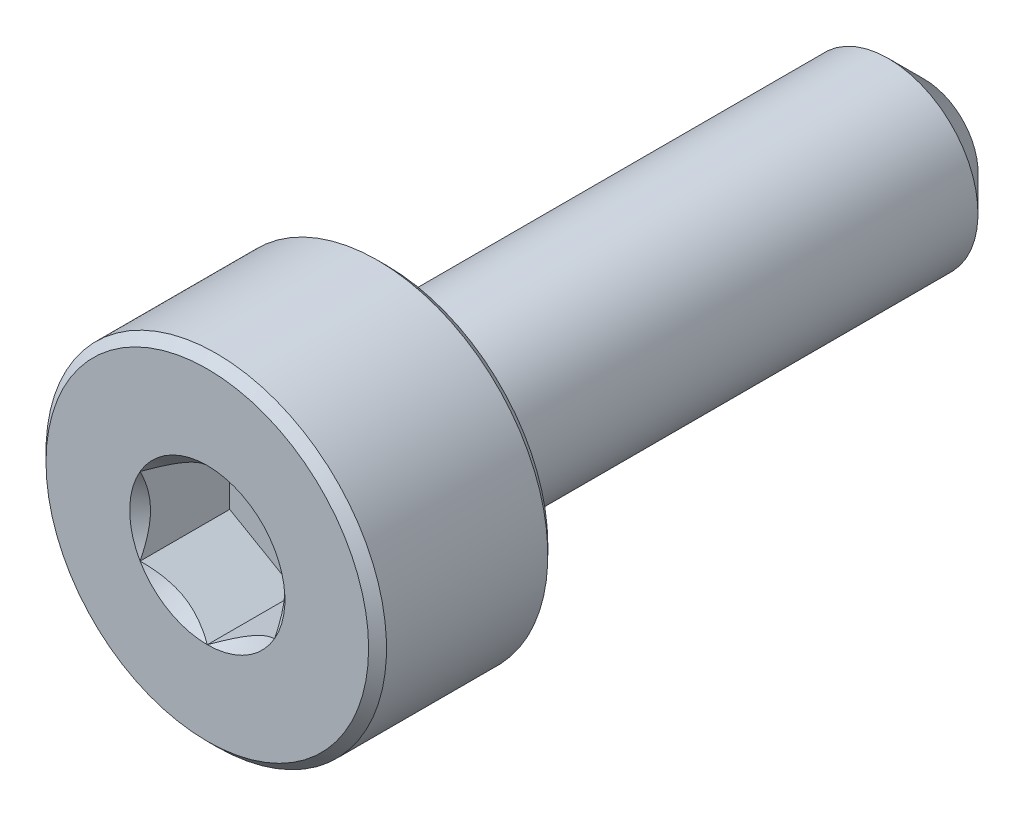
ISO-10303-21;
HEADER;
FILE_DESCRIPTION(('STEP AP214'),'2;1');
FILE_NAME('part.step','',(''),(''),'','','');
FILE_SCHEMA(('AUTOMOTIVE_DESIGN { 1 0 10303 214 1 1 1 1 }'));
ENDSEC;
DATA;
#1=APPLICATION_CONTEXT('core data for automotive mechanical design processes');
#2=APPLICATION_PROTOCOL_DEFINITION('international standard','automotive_design',2000,#1);
#3=PRODUCT_CONTEXT('',#1,'mechanical');
#4=PRODUCT('Part','Part','',(#3));
#5=PRODUCT_RELATED_PRODUCT_CATEGORY('part','',(#4));
#6=PRODUCT_DEFINITION_FORMATION('','',#4);
#7=PRODUCT_DEFINITION_CONTEXT('part definition',#1,'design');
#8=PRODUCT_DEFINITION('design','',#6,#7);
#9=PRODUCT_DEFINITION_SHAPE('','',#8);
#10=(LENGTH_UNIT() NAMED_UNIT(*) SI_UNIT(.MILLI.,.METRE.));
#11=(NAMED_UNIT(*) PLANE_ANGLE_UNIT() SI_UNIT($,.RADIAN.));
#12=(NAMED_UNIT(*) SI_UNIT($,.STERADIAN.) SOLID_ANGLE_UNIT());
#13=UNCERTAINTY_MEASURE_WITH_UNIT(LENGTH_MEASURE(1.E-05),#10,'distance_accuracy_value','');
#14=(GEOMETRIC_REPRESENTATION_CONTEXT(3) GLOBAL_UNCERTAINTY_ASSIGNED_CONTEXT((#13)) GLOBAL_UNIT_ASSIGNED_CONTEXT((#10,
#11,#12)) REPRESENTATION_CONTEXT('',''));
#15=CARTESIAN_POINT('',(0.,0.,0.));
#16=DIRECTION('',(0.,0.,1.));
#17=DIRECTION('',(1.,0.,0.));
#18=AXIS2_PLACEMENT_3D('',#15,#16,#17);
#19=CARTESIAN_POINT('',(0.75,-0.433012701892219,-0.291287847477919));
#20=DIRECTION('',(1.,0.,0.));
#21=DIRECTION('',(0.,1.,0.));
#22=AXIS2_PLACEMENT_3D('',#19,#20,#21);
#23=PLANE('',#22);
#24=DIRECTION('',(0.,0.,1.));
#25=VECTOR('',#24,1.);
#26=CARTESIAN_POINT('',(0.75,-0.433012701892219,-0.291287847477919));
#27=LINE('',#26,#25);
#28=CARTESIAN_POINT('',(0.75,-0.433012701892219,3.));
#29=VERTEX_POINT('',#28);
#30=CARTESIAN_POINT('',(0.75,-0.433012701892219,4.));
#31=VERTEX_POINT('',#30);
#32=EDGE_CURVE('E93',#29,#31,#27,.T.);
#33=ORIENTED_EDGE('',*,*,#32,.T.);
#34=CARTESIAN_POINT('',(0.75,0.433012701891378,3.99999999999958));
#35=CARTESIAN_POINT('',(0.75,0.,3.78349364905421));
#36=CARTESIAN_POINT('',(0.75,-0.433012701891376,3.99999999999958));
#37=(BOUNDED_CURVE() B_SPLINE_CURVE(2,(#34,#35,#36),.UNSPECIFIED.,.F.,
.F.) B_SPLINE_CURVE_WITH_KNOTS((3,3),(0.120361405182823,0.287808339382405),
.UNSPECIFIED.) CURVE() GEOMETRIC_REPRESENTATION_ITEM() RATIONAL_B_SPLINE_CURVE((1.61880215351743,
1.86923171819516,1.61880215351743)) REPRESENTATION_ITEM(''));
#38=CARTESIAN_POINT('',(0.75,0.43301270189222,4.));
#39=VERTEX_POINT('',#38);
#40=EDGE_CURVE('E203',#39,#31,#37,.T.);
#41=ORIENTED_EDGE('',*,*,#40,.F.);
#42=DIRECTION('',(0.,0.,1.));
#43=VECTOR('',#42,1.);
#44=CARTESIAN_POINT('',(0.75,0.43301270189222,-0.291287847477919));
#45=LINE('',#44,#43);
#46=CARTESIAN_POINT('',(0.75,0.43301270189222,3.));
#47=VERTEX_POINT('',#46);
#48=EDGE_CURVE('E11',#47,#39,#45,.T.);
#49=ORIENTED_EDGE('',*,*,#48,.F.);
#50=DIRECTION('',(0.,1.,0.));
#51=VECTOR('',#50,1.);
#52=CARTESIAN_POINT('',(0.75,-0.433012701892219,3.));
#53=LINE('',#52,#51);
#54=EDGE_CURVE('E106',#29,#47,#53,.T.);
#55=ORIENTED_EDGE('',*,*,#54,.F.);
#56=EDGE_LOOP('',(#33,#41,#49,#55));
#57=FACE_BOUND('',#56,.T.);
#58=ADVANCED_FACE('F17',(#57),#23,.F.);
#59=CARTESIAN_POINT('',(0.75,0.43301270189222,-0.291287847477919));
#60=DIRECTION('',(0.5,0.866025403784439,0.));
#61=DIRECTION('',(0.,0.,-1.));
#62=AXIS2_PLACEMENT_3D('',#59,#60,#61);
#63=PLANE('',#62);
#64=ORIENTED_EDGE('',*,*,#48,.T.);
#65=CARTESIAN_POINT('',(0.74999999999927,0.433012701892642,3.99999999999958));
#66=CARTESIAN_POINT('',(0.375000000000001,0.649519052838328,3.78349364905421));
#67=CARTESIAN_POINT('',(7.34319938311926E-13,0.866025403784015,3.99999999999958));
#68=(BOUNDED_CURVE() B_SPLINE_CURVE(2,(#65,#66,#67),.UNSPECIFIED.,.F.,
.F.) B_SPLINE_CURVE_WITH_KNOTS((3,3),(-0.287942432591297,-0.120439644657527),
.UNSPECIFIED.) CURVE() GEOMETRIC_REPRESENTATION_ITEM() RATIONAL_B_SPLINE_CURVE((1.61925176934043,
1.86975088982804,1.61925176934043)) REPRESENTATION_ITEM(''));
#69=CARTESIAN_POINT('',(0.,0.866025403784438,4.));
#70=VERTEX_POINT('',#69);
#71=EDGE_CURVE('E117',#39,#70,#68,.T.);
#72=ORIENTED_EDGE('',*,*,#71,.T.);
#73=DIRECTION('',(0.,0.,1.));
#74=VECTOR('',#73,1.);
#75=CARTESIAN_POINT('',(0.,0.866025403784439,-0.291287847477919));
#76=LINE('',#75,#74);
#77=CARTESIAN_POINT('',(0.,0.866025403784439,3.));
#78=VERTEX_POINT('',#77);
#79=EDGE_CURVE('E28',#78,#70,#76,.T.);
#80=ORIENTED_EDGE('',*,*,#79,.F.);
#81=DIRECTION('',(-0.866025403784439,0.5,0.));
#82=VECTOR('',#81,1.);
#83=CARTESIAN_POINT('',(0.75,0.43301270189222,3.));
#84=LINE('',#83,#82);
#85=EDGE_CURVE('E111',#47,#78,#84,.T.);
#86=ORIENTED_EDGE('',*,*,#85,.F.);
#87=EDGE_LOOP('',(#64,#72,#80,#86));
#88=FACE_BOUND('',#87,.T.);
#89=ADVANCED_FACE('F311',(#88),#63,.F.);
#90=CARTESIAN_POINT('',(0.,0.866025403784439,-0.291287847477919));
#91=DIRECTION('',(-0.5,0.866025403784439,0.));
#92=DIRECTION('',(0.,0.,1.));
#93=AXIS2_PLACEMENT_3D('',#90,#91,#92);
#94=PLANE('',#93);
#95=ORIENTED_EDGE('',*,*,#79,.T.);
#96=CARTESIAN_POINT('',(-7.34902731913762E-13,0.866025403784013,3.99999999999958));
#97=CARTESIAN_POINT('',(-0.375,0.649519052838328,3.78349364905421));
#98=CARTESIAN_POINT('',(-0.749999999999266,0.433012701892643,3.99999999999958));
#99=(BOUNDED_CURVE() B_SPLINE_CURVE(2,(#96,#97,#98),.UNSPECIFIED.,.F.,
.F.) B_SPLINE_CURVE_WITH_KNOTS((3,3),(-0.287942432591296,-0.120439644657527),
.UNSPECIFIED.) CURVE() GEOMETRIC_REPRESENTATION_ITEM() RATIONAL_B_SPLINE_CURVE((1.61925176934043,
1.86975088982803,1.61925176934043)) REPRESENTATION_ITEM(''));
#100=CARTESIAN_POINT('',(-0.749999999999853,0.433012701892133,3.99999999999983));
#101=VERTEX_POINT('',#100);
#102=EDGE_CURVE('E122',#70,#101,#99,.T.);
#103=ORIENTED_EDGE('',*,*,#102,.T.);
#104=DIRECTION('',(0.,0.,1.));
#105=VECTOR('',#104,1.);
#106=CARTESIAN_POINT('',(-0.75,0.433012701892219,-0.291287847477919));
#107=LINE('',#106,#105);
#108=CARTESIAN_POINT('',(-0.75,0.433012701892219,3.));
#109=VERTEX_POINT('',#108);
#110=EDGE_CURVE('E63',#109,#101,#107,.T.);
#111=ORIENTED_EDGE('',*,*,#110,.F.);
#112=DIRECTION('',(-0.866025403784439,-0.5,0.));
#113=VECTOR('',#112,1.);
#114=CARTESIAN_POINT('',(0.,0.866025403784439,3.));
#115=LINE('',#114,#113);
#116=EDGE_CURVE('E165',#78,#109,#115,.T.);
#117=ORIENTED_EDGE('',*,*,#116,.F.);
#118=EDGE_LOOP('',(#95,#103,#111,#117));
#119=FACE_BOUND('',#118,.T.);
#120=ADVANCED_FACE('F315',(#119),#94,.F.);
#121=CARTESIAN_POINT('',(-0.75,0.433012701892219,-0.291287847477919));
#122=DIRECTION('',(-1.,0.,0.));
#123=DIRECTION('',(0.,1.,0.));
#124=AXIS2_PLACEMENT_3D('',#121,#122,#123);
#125=PLANE('',#124);
#126=ORIENTED_EDGE('',*,*,#110,.T.);
#127=CARTESIAN_POINT('',(-0.749999999999999,0.433012701891368,3.99999999999958));
#128=CARTESIAN_POINT('',(-0.749999999999999,0.,3.78349364905421));
#129=CARTESIAN_POINT('',(-0.749999999999999,-0.433012701891372,3.99999999999958));
#130=(BOUNDED_CURVE() B_SPLINE_CURVE(2,(#127,#128,#129),.UNSPECIFIED.,.F.,
.F.) B_SPLINE_CURVE_WITH_KNOTS((3,3),(-0.287940668837709,-0.120438615565529),
.UNSPECIFIED.) CURVE() GEOMETRIC_REPRESENTATION_ITEM() RATIONAL_B_SPLINE_CURVE((1.61924585537602,
1.86974406097014,1.61924585537602)) REPRESENTATION_ITEM(''));
#131=CARTESIAN_POINT('',(-0.749999999999853,-0.433012701892135,3.99999999999983));
#132=VERTEX_POINT('',#131);
#133=EDGE_CURVE('E135',#101,#132,#130,.T.);
#134=ORIENTED_EDGE('',*,*,#133,.T.);
#135=DIRECTION('',(0.,0.,1.));
#136=VECTOR('',#135,1.);
#137=CARTESIAN_POINT('',(-0.75,-0.43301270189222,-0.291287847477919));
#138=LINE('',#137,#136);
#139=CARTESIAN_POINT('',(-0.75,-0.433012701892219,3.));
#140=VERTEX_POINT('',#139);
#141=EDGE_CURVE('E41',#140,#132,#138,.T.);
#142=ORIENTED_EDGE('',*,*,#141,.F.);
#143=DIRECTION('',(0.,-1.,0.));
#144=VECTOR('',#143,1.);
#145=CARTESIAN_POINT('',(-0.75,0.433012701892219,3.));
#146=LINE('',#145,#144);
#147=EDGE_CURVE('E149',#109,#140,#146,.T.);
#148=ORIENTED_EDGE('',*,*,#147,.F.);
#149=EDGE_LOOP('',(#126,#134,#142,#148));
#150=FACE_BOUND('',#149,.T.);
#151=ADVANCED_FACE('F321',(#150),#125,.F.);
#152=CARTESIAN_POINT('',(-0.75,-0.43301270189222,-0.291287847477919));
#153=DIRECTION('',(-0.5,-0.866025403784439,0.));
#154=DIRECTION('',(-0.866025403784439,0.5,0.));
#155=AXIS2_PLACEMENT_3D('',#152,#153,#154);
#156=PLANE('',#155);
#157=ORIENTED_EDGE('',*,*,#141,.T.);
#158=CARTESIAN_POINT('',(-0.749999999999265,-0.433012701892644,3.99999999999958));
#159=CARTESIAN_POINT('',(-0.375,-0.649519052838328,3.78349364905421));
#160=CARTESIAN_POINT('',(-7.34319938311926E-13,-0.866025403784015,3.99999999999958));
#161=(BOUNDED_CURVE() B_SPLINE_CURVE(2,(#158,#159,#160),.UNSPECIFIED.,.F.,
.F.) B_SPLINE_CURVE_WITH_KNOTS((3,3),(-0.287942432591297,-0.120439644657527),
.UNSPECIFIED.) CURVE() GEOMETRIC_REPRESENTATION_ITEM() RATIONAL_B_SPLINE_CURVE((1.61925176934043,
1.86975088982804,1.61925176934043)) REPRESENTATION_ITEM(''));
#162=CARTESIAN_POINT('',(0.,-0.866025403784438,4.));
#163=VERTEX_POINT('',#162);
#164=EDGE_CURVE('E132',#132,#163,#161,.T.);
#165=ORIENTED_EDGE('',*,*,#164,.T.);
#166=DIRECTION('',(0.,0.,1.));
#167=VECTOR('',#166,1.);
#168=CARTESIAN_POINT('',(0.,-0.866025403784438,-0.291287847477919));
#169=LINE('',#168,#167);
#170=CARTESIAN_POINT('',(0.,-0.866025403784438,3.));
#171=VERTEX_POINT('',#170);
#172=EDGE_CURVE('E82',#171,#163,#169,.T.);
#173=ORIENTED_EDGE('',*,*,#172,.F.);
#174=DIRECTION('',(0.866025403784439,-0.5,0.));
#175=VECTOR('',#174,1.);
#176=CARTESIAN_POINT('',(-0.75,-0.43301270189222,3.));
#177=LINE('',#176,#175);
#178=EDGE_CURVE('E115',#140,#171,#177,.T.);
#179=ORIENTED_EDGE('',*,*,#178,.F.);
#180=EDGE_LOOP('',(#157,#165,#173,#179));
#181=FACE_BOUND('',#180,.T.);
#182=ADVANCED_FACE('F325',(#181),#156,.F.);
#183=CARTESIAN_POINT('',(0.,-0.866025403784438,-0.291287847477919));
#184=DIRECTION('',(0.5,-0.866025403784439,0.));
#185=DIRECTION('',(0.,0.,-1.));
#186=AXIS2_PLACEMENT_3D('',#183,#184,#185);
#187=PLANE('',#186);
#188=ORIENTED_EDGE('',*,*,#172,.T.);
#189=CARTESIAN_POINT('',(7.31063150536968E-13,-0.866025403784016,3.99999999999958));
#190=CARTESIAN_POINT('',(0.374999999999999,-0.649519052838328,3.78349364905421));
#191=CARTESIAN_POINT('',(0.749999999999266,-0.433012701892642,3.99999999999958));
#192=(BOUNDED_CURVE() B_SPLINE_CURVE(2,(#189,#190,#191),.UNSPECIFIED.,.F.,
.F.) B_SPLINE_CURVE_WITH_KNOTS((3,3),(-0.287942432591297,-0.120439644657527),
.UNSPECIFIED.) CURVE() GEOMETRIC_REPRESENTATION_ITEM() RATIONAL_B_SPLINE_CURVE((1.61925176934043,
1.86975088982804,1.61925176934043)) REPRESENTATION_ITEM(''));
#193=EDGE_CURVE('E99',#163,#31,#192,.T.);
#194=ORIENTED_EDGE('',*,*,#193,.T.);
#195=ORIENTED_EDGE('',*,*,#32,.F.);
#196=DIRECTION('',(0.866025403784439,0.5,0.));
#197=VECTOR('',#196,1.);
#198=CARTESIAN_POINT('',(0.,-0.866025403784438,3.));
#199=LINE('',#198,#197);
#200=EDGE_CURVE('E97',#171,#29,#199,.T.);
#201=ORIENTED_EDGE('',*,*,#200,.F.);
#202=EDGE_LOOP('',(#188,#194,#195,#201));
#203=FACE_BOUND('',#202,.T.);
#204=ADVANCED_FACE('F95',(#203),#187,.F.);
#205=CARTESIAN_POINT('',(0.,1.8,3.));
#206=DIRECTION('',(0.,0.,-1.));
#207=DIRECTION('',(-1.,0.,0.));
#208=AXIS2_PLACEMENT_3D('',#205,#206,#207);
#209=PLANE('',#208);
#210=ORIENTED_EDGE('',*,*,#200,.T.);
#211=ORIENTED_EDGE('',*,*,#54,.T.);
#212=ORIENTED_EDGE('',*,*,#85,.T.);
#213=ORIENTED_EDGE('',*,*,#116,.T.);
#214=ORIENTED_EDGE('',*,*,#147,.T.);
#215=ORIENTED_EDGE('',*,*,#178,.T.);
#216=EDGE_LOOP('',(#210,#211,#212,#213,#214,#215));
#217=FACE_BOUND('',#216,.T.);
#218=ADVANCED_FACE('F113',(#217),#209,.F.);
#219=CARTESIAN_POINT('',(0.,0.,4.));
#220=DIRECTION('',(0.,0.,1.));
#221=DIRECTION('',(1.,0.,0.));
#222=AXIS2_PLACEMENT_3D('',#219,#220,#221);
#223=CONICAL_SURFACE('',#222,0.866025403784438,0.78539816339745);
#224=CARTESIAN_POINT('',(0.,0.,4.));
#225=DIRECTION('',(0.,0.,1.));
#226=DIRECTION('',(1.,0.,0.));
#227=AXIS2_PLACEMENT_3D('',#224,#225,#226);
#228=CIRCLE('',#227,0.866025403784438);
#229=EDGE_CURVE('E228',#39,#70,#228,.T.);
#230=ORIENTED_EDGE('',*,*,#229,.T.);
#231=ORIENTED_EDGE('',*,*,#71,.F.);
#232=EDGE_LOOP('',(#230,#231));
#233=FACE_BOUND('',#232,.T.);
#234=ADVANCED_FACE('F272',(#233),#223,.F.);
#235=EDGE_CURVE('E230',#70,#101,#228,.T.);
#236=ORIENTED_EDGE('',*,*,#235,.T.);
#237=ORIENTED_EDGE('',*,*,#102,.F.);
#238=EDGE_LOOP('',(#236,#237));
#239=FACE_BOUND('',#238,.T.);
#240=ADVANCED_FACE('F309',(#239),#223,.F.);
#241=CARTESIAN_POINT('',(0.,0.,4.));
#242=DIRECTION('',(0.,0.,1.));
#243=DIRECTION('',(0.,-1.,0.));
#244=AXIS2_PLACEMENT_3D('',#241,#242,#243);
#245=CIRCLE('',#244,0.866025403784438);
#246=EDGE_CURVE('E21',#101,#132,#245,.T.);
#247=ORIENTED_EDGE('',*,*,#246,.T.);
#248=ORIENTED_EDGE('',*,*,#133,.F.);
#249=EDGE_LOOP('',(#247,#248));
#250=FACE_BOUND('',#249,.T.);
#251=ADVANCED_FACE('F19',(#250),#223,.F.);
#252=EDGE_CURVE('E235',#132,#163,#228,.T.);
#253=ORIENTED_EDGE('',*,*,#252,.T.);
#254=ORIENTED_EDGE('',*,*,#164,.F.);
#255=EDGE_LOOP('',(#253,#254));
#256=FACE_BOUND('',#255,.T.);
#257=ADVANCED_FACE('F296',(#256),#223,.F.);
#258=EDGE_CURVE('E232',#163,#31,#228,.T.);
#259=ORIENTED_EDGE('',*,*,#258,.T.);
#260=ORIENTED_EDGE('',*,*,#193,.F.);
#261=EDGE_LOOP('',(#259,#260));
#262=FACE_BOUND('',#261,.T.);
#263=ADVANCED_FACE('F279',(#262),#223,.F.);
#264=CARTESIAN_POINT('',(0.,0.6,-4.));
#265=DIRECTION('',(0.,0.,-1.));
#266=DIRECTION('',(-1.,0.,0.));
#267=AXIS2_PLACEMENT_3D('',#264,#265,#266);
#268=PLANE('',#267);
#269=CARTESIAN_POINT('',(0.,0.,-4.));
#270=DIRECTION('',(0.,0.,-1.));
#271=DIRECTION('',(0.,1.,0.));
#272=AXIS2_PLACEMENT_3D('',#269,#270,#271);
#273=CIRCLE('',#272,0.6);
#274=CARTESIAN_POINT('',(0.,0.6,-4.));
#275=VERTEX_POINT('',#274);
#276=EDGE_CURVE('E237',#275,#275,#273,.T.);
#277=ORIENTED_EDGE('',*,*,#276,.T.);
#278=EDGE_LOOP('',(#277));
#279=FACE_BOUND('',#278,.T.);
#280=ADVANCED_FACE('F295',(#279),#268,.T.);
#281=CARTESIAN_POINT('',(0.,1.8,2.));
#282=DIRECTION('',(0.,0.,-1.));
#283=DIRECTION('',(-1.,0.,0.));
#284=AXIS2_PLACEMENT_3D('',#281,#282,#283);
#285=PLANE('',#284);
#286=CARTESIAN_POINT('',(0.,0.,2.));
#287=DIRECTION('',(0.,0.,-1.));
#288=DIRECTION('',(0.,1.,0.));
#289=AXIS2_PLACEMENT_3D('',#286,#287,#288);
#290=CIRCLE('',#289,1.);
#291=CARTESIAN_POINT('',(0.,1.,2.));
#292=VERTEX_POINT('',#291);
#293=EDGE_CURVE('E369',#292,#292,#290,.T.);
#294=ORIENTED_EDGE('',*,*,#293,.F.);
#295=EDGE_LOOP('',(#294));
#296=FACE_BOUND('',#295,.T.);
#297=CARTESIAN_POINT('',(0.,0.,2.));
#298=DIRECTION('',(0.,0.,-1.));
#299=DIRECTION('',(0.,1.,0.));
#300=AXIS2_PLACEMENT_3D('',#297,#298,#299);
#301=CIRCLE('',#300,1.8);
#302=CARTESIAN_POINT('',(0.,1.8,2.));
#303=VERTEX_POINT('',#302);
#304=EDGE_CURVE('E375',#303,#303,#301,.T.);
#305=ORIENTED_EDGE('',*,*,#304,.T.);
#306=EDGE_LOOP('',(#305));
#307=FACE_BOUND('',#306,.T.);
#308=ADVANCED_FACE('F303',(#296,#307),#285,.T.);
#309=CARTESIAN_POINT('',(0.,0.,4.));
#310=DIRECTION('',(0.,0.,1.));
#311=DIRECTION('',(1.,0.,0.));
#312=AXIS2_PLACEMENT_3D('',#309,#310,#311);
#313=PLANE('',#312);
#314=ORIENTED_EDGE('',*,*,#258,.F.);
#315=ORIENTED_EDGE('',*,*,#252,.F.);
#316=ORIENTED_EDGE('',*,*,#246,.F.);
#317=ORIENTED_EDGE('',*,*,#235,.F.);
#318=ORIENTED_EDGE('',*,*,#229,.F.);
#319=EDGE_CURVE('E207',#31,#39,#228,.T.);
#320=ORIENTED_EDGE('',*,*,#319,.F.);
#321=EDGE_LOOP('',(#314,#315,#316,#317,#318,#320));
#322=FACE_BOUND('',#321,.T.);
#323=CARTESIAN_POINT('',(0.,0.,4.));
#324=DIRECTION('',(0.,0.,-1.));
#325=DIRECTION('',(0.,1.,0.));
#326=AXIS2_PLACEMENT_3D('',#323,#324,#325);
#327=CIRCLE('',#326,1.8);
#328=CARTESIAN_POINT('',(0.,1.8,4.));
#329=VERTEX_POINT('',#328);
#330=EDGE_CURVE('E236',#329,#329,#327,.T.);
#331=ORIENTED_EDGE('',*,*,#330,.F.);
#332=EDGE_LOOP('',(#331));
#333=FACE_BOUND('',#332,.T.);
#334=ADVANCED_FACE('F276',(#322,#333),#313,.T.);
#335=CARTESIAN_POINT('',(0.,0.,3.9));
#336=DIRECTION('',(0.,0.,-1.));
#337=DIRECTION('',(0.,1.,0.));
#338=AXIS2_PLACEMENT_3D('',#335,#336,#337);
#339=CONICAL_SURFACE('',#338,1.9,0.785398163397452);
#340=ORIENTED_EDGE('',*,*,#330,.T.);
#341=EDGE_LOOP('',(#340));
#342=FACE_BOUND('',#341,.T.);
#343=CARTESIAN_POINT('',(0.,0.,3.9));
#344=DIRECTION('',(0.,0.,-1.));
#345=DIRECTION('',(0.,1.,0.));
#346=AXIS2_PLACEMENT_3D('',#343,#344,#345);
#347=CIRCLE('',#346,1.9);
#348=CARTESIAN_POINT('',(0.,1.9,3.9));
#349=VERTEX_POINT('',#348);
#350=EDGE_CURVE('E376',#349,#349,#347,.T.);
#351=ORIENTED_EDGE('',*,*,#350,.F.);
#352=EDGE_LOOP('',(#351));
#353=FACE_BOUND('',#352,.T.);
#354=ADVANCED_FACE('F337',(#342,#353),#339,.T.);
#355=CARTESIAN_POINT('',(0.,0.,-4.));
#356=DIRECTION('',(0.,0.,-1.));
#357=DIRECTION('',(0.,1.,0.));
#358=AXIS2_PLACEMENT_3D('',#355,#356,#357);
#359=CYLINDRICAL_SURFACE('',#358,1.9);
#360=ORIENTED_EDGE('',*,*,#350,.T.);
#361=EDGE_LOOP('',(#360));
#362=FACE_BOUND('',#361,.T.);
#363=CARTESIAN_POINT('',(0.,0.,2.1));
#364=DIRECTION('',(0.,0.,-1.));
#365=DIRECTION('',(0.,1.,0.));
#366=AXIS2_PLACEMENT_3D('',#363,#364,#365);
#367=CIRCLE('',#366,1.9);
#368=CARTESIAN_POINT('',(0.,1.9,2.1));
#369=VERTEX_POINT('',#368);
#370=EDGE_CURVE('E371',#369,#369,#367,.T.);
#371=ORIENTED_EDGE('',*,*,#370,.F.);
#372=EDGE_LOOP('',(#371));
#373=FACE_BOUND('',#372,.T.);
#374=ADVANCED_FACE('F340',(#362,#373),#359,.T.);
#375=CARTESIAN_POINT('',(0.,0.,2.));
#376=DIRECTION('',(0.,0.,1.));
#377=DIRECTION('',(0.,-1.,0.));
#378=AXIS2_PLACEMENT_3D('',#375,#376,#377);
#379=CONICAL_SURFACE('',#378,1.8,0.785398163397452);
#380=ORIENTED_EDGE('',*,*,#304,.F.);
#381=EDGE_LOOP('',(#380));
#382=FACE_BOUND('',#381,.T.);
#383=ORIENTED_EDGE('',*,*,#370,.T.);
#384=EDGE_LOOP('',(#383));
#385=FACE_BOUND('',#384,.T.);
#386=ADVANCED_FACE('F344',(#382,#385),#379,.T.);
#387=CARTESIAN_POINT('',(0.,0.,-4.));
#388=DIRECTION('',(0.,0.,-1.));
#389=DIRECTION('',(0.,1.,0.));
#390=AXIS2_PLACEMENT_3D('',#387,#388,#389);
#391=CYLINDRICAL_SURFACE('',#390,1.);
#392=ORIENTED_EDGE('',*,*,#293,.T.);
#393=EDGE_LOOP('',(#392));
#394=FACE_BOUND('',#393,.T.);
#395=CARTESIAN_POINT('',(0.,0.,-3.6));
#396=DIRECTION('',(0.,0.,-1.));
#397=DIRECTION('',(0.,1.,0.));
#398=AXIS2_PLACEMENT_3D('',#395,#396,#397);
#399=CIRCLE('',#398,1.);
#400=CARTESIAN_POINT('',(0.,1.,-3.6));
#401=VERTEX_POINT('',#400);
#402=EDGE_CURVE('E362',#401,#401,#399,.T.);
#403=ORIENTED_EDGE('',*,*,#402,.F.);
#404=EDGE_LOOP('',(#403));
#405=FACE_BOUND('',#404,.T.);
#406=ADVANCED_FACE('F348',(#394,#405),#391,.T.);
#407=CARTESIAN_POINT('',(0.,0.,-4.));
#408=DIRECTION('',(0.,0.,1.));
#409=DIRECTION('',(0.,-1.,0.));
#410=AXIS2_PLACEMENT_3D('',#407,#408,#409);
#411=CONICAL_SURFACE('',#410,0.6,0.785398163397441);
#412=ORIENTED_EDGE('',*,*,#276,.F.);
#413=EDGE_LOOP('',(#412));
#414=FACE_BOUND('',#413,.T.);
#415=ORIENTED_EDGE('',*,*,#402,.T.);
#416=EDGE_LOOP('',(#415));
#417=FACE_BOUND('',#416,.T.);
#418=ADVANCED_FACE('F307',(#414,#417),#411,.T.);
#419=ORIENTED_EDGE('',*,*,#40,.T.);
#420=ORIENTED_EDGE('',*,*,#319,.T.);
#421=EDGE_LOOP('',(#419,#420));
#422=FACE_BOUND('',#421,.T.);
#423=ADVANCED_FACE('F297',(#422),#223,.F.);
#424=CLOSED_SHELL('',(#58,#89,#120,#151,#182,#204,#218,#234,#240,#251,#257,#263,#280,#308,#334,
#354,#374,#386,#406,#418,#423));
#425=MANIFOLD_SOLID_BREP('B1',#424);
#426=ADVANCED_BREP_SHAPE_REPRESENTATION('',(#18,#425),#14);
#427=SHAPE_DEFINITION_REPRESENTATION(#9,#426);
ENDSEC;
END-ISO-10303-21;
